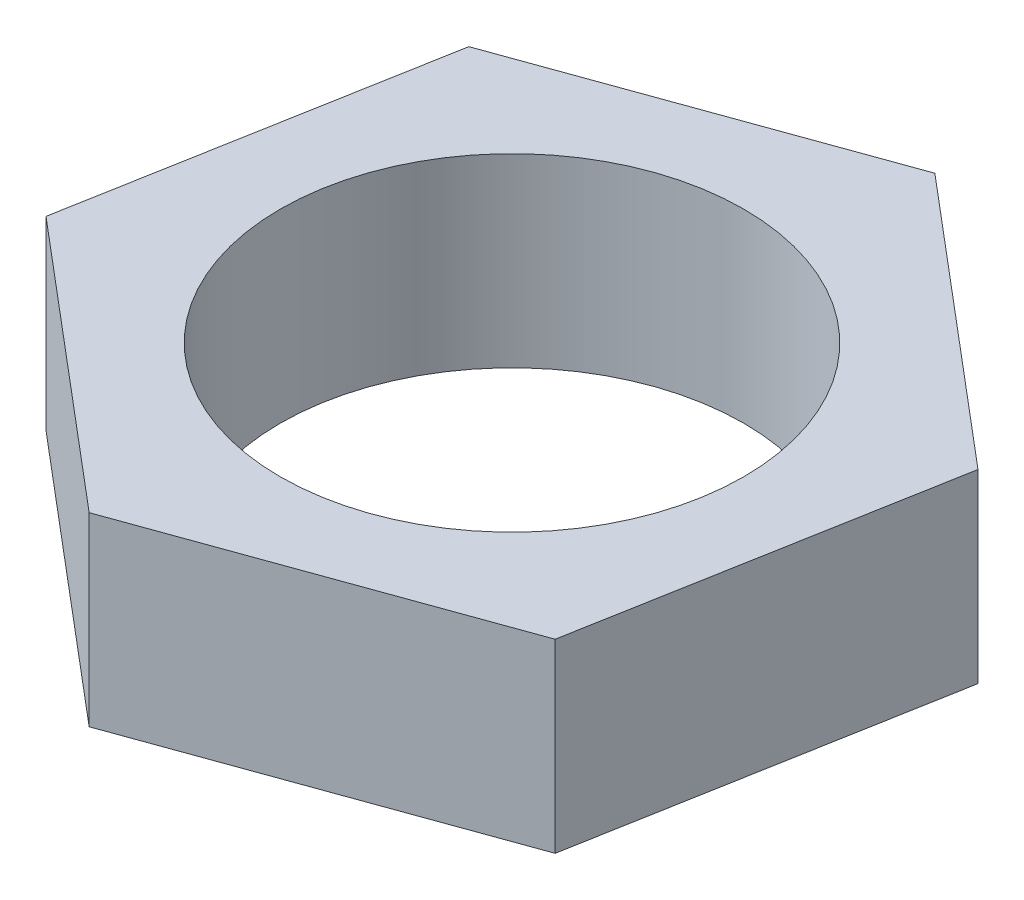
ISO-10303-21;
HEADER;
FILE_DESCRIPTION(('STEP AP214'),'2;1');
FILE_NAME('part.step','',(''),(''),'','','');
FILE_SCHEMA(('AUTOMOTIVE_DESIGN { 1 0 10303 214 1 1 1 1 }'));
ENDSEC;
DATA;
#1=APPLICATION_CONTEXT('core data for automotive mechanical design processes');
#2=APPLICATION_PROTOCOL_DEFINITION('international standard','automotive_design',2000,#1);
#3=PRODUCT_CONTEXT('',#1,'mechanical');
#4=PRODUCT('Part','Part','',(#3));
#5=PRODUCT_RELATED_PRODUCT_CATEGORY('part','',(#4));
#6=PRODUCT_DEFINITION_FORMATION('','',#4);
#7=PRODUCT_DEFINITION_CONTEXT('part definition',#1,'design');
#8=PRODUCT_DEFINITION('design','',#6,#7);
#9=PRODUCT_DEFINITION_SHAPE('','',#8);
#10=(LENGTH_UNIT() NAMED_UNIT(*) SI_UNIT(.MILLI.,.METRE.));
#11=(NAMED_UNIT(*) PLANE_ANGLE_UNIT() SI_UNIT($,.RADIAN.));
#12=(NAMED_UNIT(*) SI_UNIT($,.STERADIAN.) SOLID_ANGLE_UNIT());
#13=UNCERTAINTY_MEASURE_WITH_UNIT(LENGTH_MEASURE(1.E-05),#10,'distance_accuracy_value','');
#14=(GEOMETRIC_REPRESENTATION_CONTEXT(3) GLOBAL_UNCERTAINTY_ASSIGNED_CONTEXT((#13)) GLOBAL_UNIT_ASSIGNED_CONTEXT((#10,
#11,#12)) REPRESENTATION_CONTEXT('',''));
#15=CARTESIAN_POINT('',(0.,0.,0.));
#16=DIRECTION('',(0.,0.,1.));
#17=DIRECTION('',(1.,0.,0.));
#18=AXIS2_PLACEMENT_3D('',#15,#16,#17);
#19=CARTESIAN_POINT('',(0.,2.,0.));
#20=DIRECTION('',(0.,1.,0.));
#21=DIRECTION('',(0.,0.,1.));
#22=AXIS2_PLACEMENT_3D('',#19,#20,#21);
#23=PLANE('',#22);
#24=DIRECTION('',(0.176973589626295,0.,-0.984215600656067));
#25=VECTOR('',#24,1.);
#26=CARTESIAN_POINT('',(3.,2.,2.53461585909779));
#27=LINE('',#26,#25);
#28=CARTESIAN_POINT('',(3.,2.,2.53461585909779));
#29=VERTEX_POINT('',#28);
#30=CARTESIAN_POINT('',(3.69504172281361,2.,-1.33076828180442));
#31=VERTEX_POINT('',#30);
#32=EDGE_CURVE('E135',#29,#31,#27,.T.);
#33=ORIENTED_EDGE('',*,*,#32,.T.);
#34=DIRECTION('',(-0.763868918155967,0.,-0.645371424743328));
#35=VECTOR('',#34,1.);
#36=CARTESIAN_POINT('',(3.69504172281361,2.,-1.33076828180442));
#37=LINE('',#36,#35);
#38=CARTESIAN_POINT('',(0.695041722813605,2.,-3.86538414090221));
#39=VERTEX_POINT('',#38);
#40=EDGE_CURVE('E93',#31,#39,#37,.T.);
#41=ORIENTED_EDGE('',*,*,#40,.T.);
#42=DIRECTION('',(-0.940842507782262,0.,0.33884417591274));
#43=VECTOR('',#42,1.);
#44=CARTESIAN_POINT('',(0.695041722813605,2.,-3.86538414090221));
#45=LINE('',#44,#43);
#46=CARTESIAN_POINT('',(-3.,2.,-2.53461585909779));
#47=VERTEX_POINT('',#46);
#48=EDGE_CURVE('E106',#39,#47,#45,.T.);
#49=ORIENTED_EDGE('',*,*,#48,.T.);
#50=DIRECTION('',(-0.176973589626295,0.,0.984215600656067));
#51=VECTOR('',#50,1.);
#52=CARTESIAN_POINT('',(-3.,2.,-2.53461585909779));
#53=LINE('',#52,#51);
#54=CARTESIAN_POINT('',(-3.69504172281361,2.,1.33076828180442));
#55=VERTEX_POINT('',#54);
#56=EDGE_CURVE('E100',#47,#55,#53,.T.);
#57=ORIENTED_EDGE('',*,*,#56,.T.);
#58=DIRECTION('',(0.763868918155967,0.,0.645371424743328));
#59=VECTOR('',#58,1.);
#60=CARTESIAN_POINT('',(-3.69504172281361,2.,1.33076828180442));
#61=LINE('',#60,#59);
#62=CARTESIAN_POINT('',(-0.695041722813605,2.,3.86538414090221));
#63=VERTEX_POINT('',#62);
#64=EDGE_CURVE('E104',#55,#63,#61,.T.);
#65=ORIENTED_EDGE('',*,*,#64,.T.);
#66=DIRECTION('',(0.940842507782262,0.,-0.338844175912739));
#67=VECTOR('',#66,1.);
#68=CARTESIAN_POINT('',(-0.695041722813605,2.,3.86538414090221));
#69=LINE('',#68,#67);
#70=EDGE_CURVE('E56',#63,#29,#69,.T.);
#71=ORIENTED_EDGE('',*,*,#70,.T.);
#72=EDGE_LOOP('',(#33,#41,#49,#57,#65,#71));
#73=FACE_BOUND('',#72,.T.);
#74=CARTESIAN_POINT('',(0.,2.,0.));
#75=DIRECTION('',(0.,1.,0.));
#76=DIRECTION('',(0.,0.,1.));
#77=AXIS2_PLACEMENT_3D('',#74,#75,#76);
#78=CIRCLE('',#77,2.5);
#79=CARTESIAN_POINT('',(0.,2.,2.5));
#80=VERTEX_POINT('',#79);
#81=EDGE_CURVE('E128',#80,#80,#78,.T.);
#82=ORIENTED_EDGE('',*,*,#81,.F.);
#83=EDGE_LOOP('',(#82));
#84=FACE_BOUND('',#83,.T.);
#85=ADVANCED_FACE('F39',(#73,#84),#23,.T.);
#86=CARTESIAN_POINT('',(0.,0.,0.));
#87=DIRECTION('',(0.,1.,0.));
#88=DIRECTION('',(0.,0.,1.));
#89=AXIS2_PLACEMENT_3D('',#86,#87,#88);
#90=PLANE('',#89);
#91=DIRECTION('',(0.176973589626295,0.,-0.984215600656067));
#92=VECTOR('',#91,1.);
#93=CARTESIAN_POINT('',(3.,0.,2.53461585909779));
#94=LINE('',#93,#92);
#95=CARTESIAN_POINT('',(3.,0.,2.53461585909779));
#96=VERTEX_POINT('',#95);
#97=CARTESIAN_POINT('',(3.69504172281361,0.,-1.33076828180442));
#98=VERTEX_POINT('',#97);
#99=EDGE_CURVE('E124',#96,#98,#94,.T.);
#100=ORIENTED_EDGE('',*,*,#99,.F.);
#101=DIRECTION('',(0.940842507782262,0.,-0.338844175912739));
#102=VECTOR('',#101,1.);
#103=CARTESIAN_POINT('',(-0.695041722813605,0.,3.86538414090221));
#104=LINE('',#103,#102);
#105=CARTESIAN_POINT('',(-0.695041722813605,0.,3.86538414090221));
#106=VERTEX_POINT('',#105);
#107=EDGE_CURVE('E85',#106,#96,#104,.T.);
#108=ORIENTED_EDGE('',*,*,#107,.F.);
#109=DIRECTION('',(0.763868918155967,0.,0.645371424743328));
#110=VECTOR('',#109,1.);
#111=CARTESIAN_POINT('',(-3.69504172281361,0.,1.33076828180442));
#112=LINE('',#111,#110);
#113=CARTESIAN_POINT('',(-3.69504172281361,0.,1.33076828180442));
#114=VERTEX_POINT('',#113);
#115=EDGE_CURVE('E79',#114,#106,#112,.T.);
#116=ORIENTED_EDGE('',*,*,#115,.F.);
#117=DIRECTION('',(-0.176973589626295,0.,0.984215600656067));
#118=VECTOR('',#117,1.);
#119=CARTESIAN_POINT('',(-3.,0.,-2.53461585909779));
#120=LINE('',#119,#118);
#121=CARTESIAN_POINT('',(-3.,0.,-2.53461585909779));
#122=VERTEX_POINT('',#121);
#123=EDGE_CURVE('E114',#122,#114,#120,.T.);
#124=ORIENTED_EDGE('',*,*,#123,.F.);
#125=DIRECTION('',(-0.940842507782262,0.,0.33884417591274));
#126=VECTOR('',#125,1.);
#127=CARTESIAN_POINT('',(0.695041722813605,0.,-3.86538414090221));
#128=LINE('',#127,#126);
#129=CARTESIAN_POINT('',(0.695041722813605,0.,-3.86538414090221));
#130=VERTEX_POINT('',#129);
#131=EDGE_CURVE('E130',#130,#122,#128,.T.);
#132=ORIENTED_EDGE('',*,*,#131,.F.);
#133=DIRECTION('',(-0.763868918155967,0.,-0.645371424743328));
#134=VECTOR('',#133,1.);
#135=CARTESIAN_POINT('',(3.69504172281361,0.,-1.33076828180442));
#136=LINE('',#135,#134);
#137=EDGE_CURVE('E127',#98,#130,#136,.T.);
#138=ORIENTED_EDGE('',*,*,#137,.F.);
#139=EDGE_LOOP('',(#100,#108,#116,#124,#132,#138));
#140=FACE_BOUND('',#139,.T.);
#141=CARTESIAN_POINT('',(0.,0.,0.));
#142=DIRECTION('',(0.,1.,0.));
#143=DIRECTION('',(0.,0.,1.));
#144=AXIS2_PLACEMENT_3D('',#141,#142,#143);
#145=CIRCLE('',#144,2.5);
#146=CARTESIAN_POINT('',(0.,0.,2.5));
#147=VERTEX_POINT('',#146);
#148=EDGE_CURVE('E246',#147,#147,#145,.T.);
#149=ORIENTED_EDGE('',*,*,#148,.T.);
#150=EDGE_LOOP('',(#149));
#151=FACE_BOUND('',#150,.T.);
#152=ADVANCED_FACE('F144',(#140,#151),#90,.F.);
#153=CARTESIAN_POINT('',(3.,2.,2.53461585909779));
#154=DIRECTION('',(-0.984215600656068,0.,-0.176973589626295));
#155=DIRECTION('',(-0.176973589626295,0.,0.984215600656068));
#156=AXIS2_PLACEMENT_3D('',#153,#154,#155);
#157=PLANE('',#156);
#158=ORIENTED_EDGE('',*,*,#99,.T.);
#159=DIRECTION('',(0.,-1.,0.));
#160=VECTOR('',#159,1.);
#161=CARTESIAN_POINT('',(3.69504172281361,2.,-1.33076828180442));
#162=LINE('',#161,#160);
#163=EDGE_CURVE('E11',#31,#98,#162,.T.);
#164=ORIENTED_EDGE('',*,*,#163,.F.);
#165=ORIENTED_EDGE('',*,*,#32,.F.);
#166=DIRECTION('',(0.,-1.,0.));
#167=VECTOR('',#166,1.);
#168=CARTESIAN_POINT('',(3.,2.,2.53461585909779));
#169=LINE('',#168,#167);
#170=EDGE_CURVE('E120',#29,#96,#169,.T.);
#171=ORIENTED_EDGE('',*,*,#170,.T.);
#172=EDGE_LOOP('',(#158,#164,#165,#171));
#173=FACE_BOUND('',#172,.T.);
#174=ADVANCED_FACE('F41',(#173),#157,.F.);
#175=CARTESIAN_POINT('',(3.69504172281361,2.,-1.33076828180442));
#176=DIRECTION('',(-0.645371424743328,0.,0.763868918155967));
#177=DIRECTION('',(0.763868918155967,0.,0.645371424743328));
#178=AXIS2_PLACEMENT_3D('',#175,#176,#177);
#179=PLANE('',#178);
#180=ORIENTED_EDGE('',*,*,#137,.T.);
#181=DIRECTION('',(0.,-1.,0.));
#182=VECTOR('',#181,1.);
#183=CARTESIAN_POINT('',(0.695041722813605,2.,-3.86538414090221));
#184=LINE('',#183,#182);
#185=EDGE_CURVE('E48',#39,#130,#184,.T.);
#186=ORIENTED_EDGE('',*,*,#185,.F.);
#187=ORIENTED_EDGE('',*,*,#40,.F.);
#188=ORIENTED_EDGE('',*,*,#163,.T.);
#189=EDGE_LOOP('',(#180,#186,#187,#188));
#190=FACE_BOUND('',#189,.T.);
#191=ADVANCED_FACE('F169',(#190),#179,.F.);
#192=CARTESIAN_POINT('',(0.695041722813605,2.,-3.86538414090221));
#193=DIRECTION('',(0.33884417591274,0.,0.940842507782262));
#194=DIRECTION('',(0.940842507782262,0.,-0.33884417591274));
#195=AXIS2_PLACEMENT_3D('',#192,#193,#194);
#196=PLANE('',#195);
#197=ORIENTED_EDGE('',*,*,#131,.T.);
#198=DIRECTION('',(0.,-1.,0.));
#199=VECTOR('',#198,1.);
#200=CARTESIAN_POINT('',(-3.,2.,-2.53461585909779));
#201=LINE('',#200,#199);
#202=EDGE_CURVE('E115',#47,#122,#201,.T.);
#203=ORIENTED_EDGE('',*,*,#202,.F.);
#204=ORIENTED_EDGE('',*,*,#48,.F.);
#205=ORIENTED_EDGE('',*,*,#185,.T.);
#206=EDGE_LOOP('',(#197,#203,#204,#205));
#207=FACE_BOUND('',#206,.T.);
#208=ADVANCED_FACE('F141',(#207),#196,.F.);
#209=CARTESIAN_POINT('',(-3.,2.,-2.53461585909779));
#210=DIRECTION('',(0.984215600656068,0.,0.176973589626295));
#211=DIRECTION('',(0.176973589626295,0.,-0.984215600656068));
#212=AXIS2_PLACEMENT_3D('',#209,#210,#211);
#213=PLANE('',#212);
#214=ORIENTED_EDGE('',*,*,#123,.T.);
#215=DIRECTION('',(0.,-1.,0.));
#216=VECTOR('',#215,1.);
#217=CARTESIAN_POINT('',(-3.69504172281361,2.,1.33076828180442));
#218=LINE('',#217,#216);
#219=EDGE_CURVE('E111',#55,#114,#218,.T.);
#220=ORIENTED_EDGE('',*,*,#219,.F.);
#221=ORIENTED_EDGE('',*,*,#56,.F.);
#222=ORIENTED_EDGE('',*,*,#202,.T.);
#223=EDGE_LOOP('',(#214,#220,#221,#222));
#224=FACE_BOUND('',#223,.T.);
#225=ADVANCED_FACE('F112',(#224),#213,.F.);
#226=CARTESIAN_POINT('',(-3.69504172281361,2.,1.33076828180442));
#227=DIRECTION('',(0.645371424743328,0.,-0.763868918155967));
#228=DIRECTION('',(-0.763868918155967,0.,-0.645371424743328));
#229=AXIS2_PLACEMENT_3D('',#226,#227,#228);
#230=PLANE('',#229);
#231=ORIENTED_EDGE('',*,*,#115,.T.);
#232=DIRECTION('',(0.,-1.,0.));
#233=VECTOR('',#232,1.);
#234=CARTESIAN_POINT('',(-0.695041722813605,2.,3.86538414090221));
#235=LINE('',#234,#233);
#236=EDGE_CURVE('E116',#63,#106,#235,.T.);
#237=ORIENTED_EDGE('',*,*,#236,.F.);
#238=ORIENTED_EDGE('',*,*,#64,.F.);
#239=ORIENTED_EDGE('',*,*,#219,.T.);
#240=EDGE_LOOP('',(#231,#237,#238,#239));
#241=FACE_BOUND('',#240,.T.);
#242=ADVANCED_FACE('F118',(#241),#230,.F.);
#243=CARTESIAN_POINT('',(-0.695041722813605,2.,3.86538414090221));
#244=DIRECTION('',(-0.338844175912739,0.,-0.940842507782262));
#245=DIRECTION('',(-0.940842507782263,0.,0.338844175912739));
#246=AXIS2_PLACEMENT_3D('',#243,#244,#245);
#247=PLANE('',#246);
#248=ORIENTED_EDGE('',*,*,#107,.T.);
#249=ORIENTED_EDGE('',*,*,#170,.F.);
#250=ORIENTED_EDGE('',*,*,#70,.F.);
#251=ORIENTED_EDGE('',*,*,#236,.T.);
#252=EDGE_LOOP('',(#248,#249,#250,#251));
#253=FACE_BOUND('',#252,.T.);
#254=ADVANCED_FACE('F149',(#253),#247,.F.);
#255=CARTESIAN_POINT('',(0.,2.,0.));
#256=DIRECTION('',(0.,-1.,0.));
#257=DIRECTION('',(0.,0.,-1.));
#258=AXIS2_PLACEMENT_3D('',#255,#256,#257);
#259=CYLINDRICAL_SURFACE('',#258,2.5);
#260=ORIENTED_EDGE('',*,*,#81,.T.);
#261=EDGE_LOOP('',(#260));
#262=FACE_BOUND('',#261,.T.);
#263=ORIENTED_EDGE('',*,*,#148,.F.);
#264=EDGE_LOOP('',(#263));
#265=FACE_BOUND('',#264,.T.);
#266=ADVANCED_FACE('F151',(#262,#265),#259,.F.);
#267=CLOSED_SHELL('',(#85,#152,#174,#191,#208,#225,#242,#254,#266));
#268=MANIFOLD_SOLID_BREP('B2',#267);
#269=ADVANCED_BREP_SHAPE_REPRESENTATION('',(#18,#268),#14);
#270=SHAPE_DEFINITION_REPRESENTATION(#9,#269);
ENDSEC;
END-ISO-10303-21;
